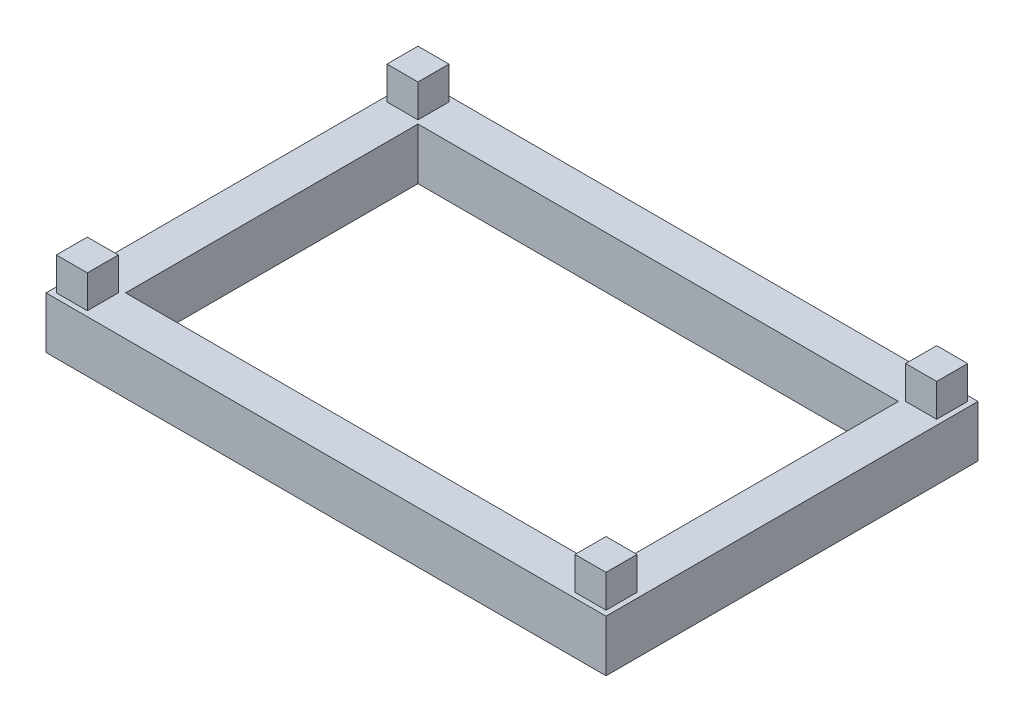
ISO-10303-21;
HEADER;
FILE_DESCRIPTION(('STEP AP214'),'2;1');
FILE_NAME('part.step','',(''),(''),'','','');
FILE_SCHEMA(('AUTOMOTIVE_DESIGN { 1 0 10303 214 1 1 1 1 }'));
ENDSEC;
DATA;
#1=APPLICATION_CONTEXT('core data for automotive mechanical design processes');
#2=APPLICATION_PROTOCOL_DEFINITION('international standard','automotive_design',2000,#1);
#3=PRODUCT_CONTEXT('',#1,'mechanical');
#4=PRODUCT('Part','Part','',(#3));
#5=PRODUCT_RELATED_PRODUCT_CATEGORY('part','',(#4));
#6=PRODUCT_DEFINITION_FORMATION('','',#4);
#7=PRODUCT_DEFINITION_CONTEXT('part definition',#1,'design');
#8=PRODUCT_DEFINITION('design','',#6,#7);
#9=PRODUCT_DEFINITION_SHAPE('','',#8);
#10=(LENGTH_UNIT() NAMED_UNIT(*) SI_UNIT(.MILLI.,.METRE.));
#11=(NAMED_UNIT(*) PLANE_ANGLE_UNIT() SI_UNIT($,.RADIAN.));
#12=(NAMED_UNIT(*) SI_UNIT($,.STERADIAN.) SOLID_ANGLE_UNIT());
#13=UNCERTAINTY_MEASURE_WITH_UNIT(LENGTH_MEASURE(1.E-05),#10,'distance_accuracy_value','');
#14=(GEOMETRIC_REPRESENTATION_CONTEXT(3) GLOBAL_UNCERTAINTY_ASSIGNED_CONTEXT((#13)) GLOBAL_UNIT_ASSIGNED_CONTEXT((#10,
#11,#12)) REPRESENTATION_CONTEXT('',''));
#15=CARTESIAN_POINT('',(0.,0.,0.));
#16=DIRECTION('',(0.,0.,1.));
#17=DIRECTION('',(1.,0.,0.));
#18=AXIS2_PLACEMENT_3D('',#15,#16,#17);
#19=CARTESIAN_POINT('',(0.,10.,0.));
#20=DIRECTION('',(0.,-1.,0.));
#21=DIRECTION('',(0.,0.,-1.));
#22=AXIS2_PLACEMENT_3D('',#19,#20,#21);
#23=PLANE('',#22);
#24=DIRECTION('',(0.,0.,1.));
#25=VECTOR('',#24,1.);
#26=CARTESIAN_POINT('',(1.,10.,-71.));
#27=LINE('',#26,#25);
#28=CARTESIAN_POINT('',(1.,10.,-71.));
#29=VERTEX_POINT('',#28);
#30=CARTESIAN_POINT('',(1.,10.,-65.));
#31=VERTEX_POINT('',#30);
#32=EDGE_CURVE('E218',#29,#31,#27,.T.);
#33=ORIENTED_EDGE('',*,*,#32,.F.);
#34=DIRECTION('',(-1.,0.,0.));
#35=VECTOR('',#34,1.);
#36=CARTESIAN_POINT('',(1.,10.,-71.));
#37=LINE('',#36,#35);
#38=CARTESIAN_POINT('',(7.,10.,-71.));
#39=VERTEX_POINT('',#38);
#40=EDGE_CURVE('E231',#39,#29,#37,.T.);
#41=ORIENTED_EDGE('',*,*,#40,.F.);
#42=DIRECTION('',(0.,0.,-1.));
#43=VECTOR('',#42,1.);
#44=CARTESIAN_POINT('',(7.,10.,-71.));
#45=LINE('',#44,#43);
#46=CARTESIAN_POINT('',(7.,10.,-65.));
#47=VERTEX_POINT('',#46);
#48=EDGE_CURVE('E240',#47,#39,#45,.T.);
#49=ORIENTED_EDGE('',*,*,#48,.F.);
#50=DIRECTION('',(1.,0.,0.));
#51=VECTOR('',#50,1.);
#52=CARTESIAN_POINT('',(1.,10.,-65.));
#53=LINE('',#52,#51);
#54=EDGE_CURVE('E221',#31,#47,#53,.T.);
#55=ORIENTED_EDGE('',*,*,#54,.F.);
#56=EDGE_LOOP('',(#33,#41,#49,#55));
#57=FACE_BOUND('',#56,.T.);
#58=DIRECTION('',(0.,0.,1.));
#59=VECTOR('',#58,1.);
#60=CARTESIAN_POINT('',(1.00000000000002,10.,-7.));
#61=LINE('',#60,#59);
#62=CARTESIAN_POINT('',(1.00000000000002,10.,-7.));
#63=VERTEX_POINT('',#62);
#64=CARTESIAN_POINT('',(1.00000000000002,10.,-1.));
#65=VERTEX_POINT('',#64);
#66=EDGE_CURVE('E289',#63,#65,#61,.T.);
#67=ORIENTED_EDGE('',*,*,#66,.F.);
#68=DIRECTION('',(-1.,0.,0.));
#69=VECTOR('',#68,1.);
#70=CARTESIAN_POINT('',(1.00000000000002,10.,-7.));
#71=LINE('',#70,#69);
#72=CARTESIAN_POINT('',(7.00000000000002,10.,-7.));
#73=VERTEX_POINT('',#72);
#74=EDGE_CURVE('E294',#73,#63,#71,.T.);
#75=ORIENTED_EDGE('',*,*,#74,.F.);
#76=DIRECTION('',(0.,0.,-1.));
#77=VECTOR('',#76,1.);
#78=CARTESIAN_POINT('',(7.00000000000002,10.,-7.));
#79=LINE('',#78,#77);
#80=CARTESIAN_POINT('',(7.00000000000002,10.,-1.));
#81=VERTEX_POINT('',#80);
#82=EDGE_CURVE('E306',#81,#73,#79,.T.);
#83=ORIENTED_EDGE('',*,*,#82,.F.);
#84=DIRECTION('',(1.,0.,0.));
#85=VECTOR('',#84,1.);
#86=CARTESIAN_POINT('',(1.00000000000002,10.,-1.));
#87=LINE('',#86,#85);
#88=EDGE_CURVE('E303',#65,#81,#87,.T.);
#89=ORIENTED_EDGE('',*,*,#88,.F.);
#90=EDGE_LOOP('',(#67,#75,#83,#89));
#91=FACE_BOUND('',#90,.T.);
#92=DIRECTION('',(1.,0.,0.));
#93=VECTOR('',#92,1.);
#94=CARTESIAN_POINT('',(7.7,10.,-7.7));
#95=LINE('',#94,#93);
#96=CARTESIAN_POINT('',(7.7,10.,-7.7));
#97=VERTEX_POINT('',#96);
#98=CARTESIAN_POINT('',(100.7,10.,-7.7));
#99=VERTEX_POINT('',#98);
#100=EDGE_CURVE('E338',#97,#99,#95,.T.);
#101=ORIENTED_EDGE('',*,*,#100,.F.);
#102=DIRECTION('',(0.,0.,1.));
#103=VECTOR('',#102,1.);
#104=CARTESIAN_POINT('',(7.7,10.,-64.3));
#105=LINE('',#104,#103);
#106=CARTESIAN_POINT('',(7.7,10.,-64.3));
#107=VERTEX_POINT('',#106);
#108=EDGE_CURVE('E322',#107,#97,#105,.T.);
#109=ORIENTED_EDGE('',*,*,#108,.F.);
#110=DIRECTION('',(-1.,0.,0.));
#111=VECTOR('',#110,1.);
#112=CARTESIAN_POINT('',(100.7,10.,-64.3));
#113=LINE('',#112,#111);
#114=CARTESIAN_POINT('',(100.7,10.,-64.3));
#115=VERTEX_POINT('',#114);
#116=EDGE_CURVE('E327',#115,#107,#113,.T.);
#117=ORIENTED_EDGE('',*,*,#116,.F.);
#118=DIRECTION('',(0.,0.,-1.));
#119=VECTOR('',#118,1.);
#120=CARTESIAN_POINT('',(100.7,10.,-7.7));
#121=LINE('',#120,#119);
#122=EDGE_CURVE('E341',#99,#115,#121,.T.);
#123=ORIENTED_EDGE('',*,*,#122,.F.);
#124=EDGE_LOOP('',(#101,#109,#117,#123));
#125=FACE_BOUND('',#124,.T.);
#126=DIRECTION('',(0.,0.,1.));
#127=VECTOR('',#126,1.);
#128=CARTESIAN_POINT('',(0.,10.,0.));
#129=LINE('',#128,#127);
#130=CARTESIAN_POINT('',(0.,10.,-72.));
#131=VERTEX_POINT('',#130);
#132=CARTESIAN_POINT('',(0.,10.,0.));
#133=VERTEX_POINT('',#132);
#134=EDGE_CURVE('E355',#131,#133,#129,.T.);
#135=ORIENTED_EDGE('',*,*,#134,.T.);
#136=DIRECTION('',(1.,0.,0.));
#137=VECTOR('',#136,1.);
#138=CARTESIAN_POINT('',(0.,10.,0.));
#139=LINE('',#138,#137);
#140=CARTESIAN_POINT('',(108.4,10.,0.));
#141=VERTEX_POINT('',#140);
#142=EDGE_CURVE('E358',#133,#141,#139,.T.);
#143=ORIENTED_EDGE('',*,*,#142,.T.);
#144=DIRECTION('',(0.,0.,-1.));
#145=VECTOR('',#144,1.);
#146=CARTESIAN_POINT('',(108.4,10.,0.));
#147=LINE('',#146,#145);
#148=CARTESIAN_POINT('',(108.4,10.,-72.));
#149=VERTEX_POINT('',#148);
#150=EDGE_CURVE('E361',#141,#149,#147,.T.);
#151=ORIENTED_EDGE('',*,*,#150,.T.);
#152=DIRECTION('',(-1.,0.,0.));
#153=VECTOR('',#152,1.);
#154=CARTESIAN_POINT('',(0.,10.,-72.));
#155=LINE('',#154,#153);
#156=EDGE_CURVE('E363',#149,#131,#155,.T.);
#157=ORIENTED_EDGE('',*,*,#156,.T.);
#158=EDGE_LOOP('',(#135,#143,#151,#157));
#159=FACE_BOUND('',#158,.T.);
#160=DIRECTION('',(0.,0.,1.));
#161=VECTOR('',#160,1.);
#162=CARTESIAN_POINT('',(101.4,10.,-7.));
#163=LINE('',#162,#161);
#164=CARTESIAN_POINT('',(101.4,10.,-7.));
#165=VERTEX_POINT('',#164);
#166=CARTESIAN_POINT('',(101.4,10.,-1.));
#167=VERTEX_POINT('',#166);
#168=EDGE_CURVE('E256',#165,#167,#163,.T.);
#169=ORIENTED_EDGE('',*,*,#168,.F.);
#170=DIRECTION('',(-1.,0.,0.));
#171=VECTOR('',#170,1.);
#172=CARTESIAN_POINT('',(101.4,10.,-7.));
#173=LINE('',#172,#171);
#174=CARTESIAN_POINT('',(107.4,10.,-7.));
#175=VERTEX_POINT('',#174);
#176=EDGE_CURVE('E261',#175,#165,#173,.T.);
#177=ORIENTED_EDGE('',*,*,#176,.F.);
#178=DIRECTION('',(0.,0.,-1.));
#179=VECTOR('',#178,1.);
#180=CARTESIAN_POINT('',(107.4,10.,-7.));
#181=LINE('',#180,#179);
#182=CARTESIAN_POINT('',(107.4,10.,-1.));
#183=VERTEX_POINT('',#182);
#184=EDGE_CURVE('E273',#183,#175,#181,.T.);
#185=ORIENTED_EDGE('',*,*,#184,.F.);
#186=DIRECTION('',(1.,0.,0.));
#187=VECTOR('',#186,1.);
#188=CARTESIAN_POINT('',(101.4,10.,-1.));
#189=LINE('',#188,#187);
#190=EDGE_CURVE('E270',#167,#183,#189,.T.);
#191=ORIENTED_EDGE('',*,*,#190,.F.);
#192=EDGE_LOOP('',(#169,#177,#185,#191));
#193=FACE_BOUND('',#192,.T.);
#194=DIRECTION('',(0.,0.,1.));
#195=VECTOR('',#194,1.);
#196=CARTESIAN_POINT('',(101.4,10.,-71.));
#197=LINE('',#196,#195);
#198=CARTESIAN_POINT('',(101.4,10.,-71.));
#199=VERTEX_POINT('',#198);
#200=CARTESIAN_POINT('',(101.4,10.,-65.));
#201=VERTEX_POINT('',#200);
#202=EDGE_CURVE('E217',#199,#201,#197,.T.);
#203=ORIENTED_EDGE('',*,*,#202,.F.);
#204=DIRECTION('',(-1.,0.,0.));
#205=VECTOR('',#204,1.);
#206=CARTESIAN_POINT('',(101.4,10.,-71.));
#207=LINE('',#206,#205);
#208=CARTESIAN_POINT('',(107.4,10.,-71.));
#209=VERTEX_POINT('',#208);
#210=EDGE_CURVE('E214',#209,#199,#207,.T.);
#211=ORIENTED_EDGE('',*,*,#210,.F.);
#212=DIRECTION('',(0.,0.,-1.));
#213=VECTOR('',#212,1.);
#214=CARTESIAN_POINT('',(107.4,10.,-71.));
#215=LINE('',#214,#213);
#216=CARTESIAN_POINT('',(107.4,10.,-65.));
#217=VERTEX_POINT('',#216);
#218=EDGE_CURVE('E56',#217,#209,#215,.T.);
#219=ORIENTED_EDGE('',*,*,#218,.F.);
#220=DIRECTION('',(1.,0.,0.));
#221=VECTOR('',#220,1.);
#222=CARTESIAN_POINT('',(101.4,10.,-65.));
#223=LINE('',#222,#221);
#224=EDGE_CURVE('E51',#201,#217,#223,.T.);
#225=ORIENTED_EDGE('',*,*,#224,.F.);
#226=EDGE_LOOP('',(#203,#211,#219,#225));
#227=FACE_BOUND('',#226,.T.);
#228=ADVANCED_FACE('F36',(#57,#91,#125,#159,#193,#227),#23,.F.);
#229=CARTESIAN_POINT('',(0.,10.,0.));
#230=DIRECTION('',(1.,0.,0.));
#231=DIRECTION('',(0.,0.,-1.));
#232=AXIS2_PLACEMENT_3D('',#229,#230,#231);
#233=PLANE('',#232);
#234=DIRECTION('',(0.,0.,1.));
#235=VECTOR('',#234,1.);
#236=CARTESIAN_POINT('',(0.,0.,0.));
#237=LINE('',#236,#235);
#238=CARTESIAN_POINT('',(0.,0.,-72.));
#239=VERTEX_POINT('',#238);
#240=CARTESIAN_POINT('',(0.,0.,0.));
#241=VERTEX_POINT('',#240);
#242=EDGE_CURVE('E348',#239,#241,#237,.T.);
#243=ORIENTED_EDGE('',*,*,#242,.T.);
#244=DIRECTION('',(0.,-1.,0.));
#245=VECTOR('',#244,1.);
#246=CARTESIAN_POINT('',(0.,10.,0.));
#247=LINE('',#246,#245);
#248=EDGE_CURVE('E11',#133,#241,#247,.T.);
#249=ORIENTED_EDGE('',*,*,#248,.F.);
#250=ORIENTED_EDGE('',*,*,#134,.F.);
#251=DIRECTION('',(0.,-1.,0.));
#252=VECTOR('',#251,1.);
#253=CARTESIAN_POINT('',(0.,10.,-72.));
#254=LINE('',#253,#252);
#255=EDGE_CURVE('E365',#131,#239,#254,.T.);
#256=ORIENTED_EDGE('',*,*,#255,.T.);
#257=EDGE_LOOP('',(#243,#249,#250,#256));
#258=FACE_BOUND('',#257,.T.);
#259=ADVANCED_FACE('F38',(#258),#233,.F.);
#260=CARTESIAN_POINT('',(0.,10.,0.));
#261=DIRECTION('',(0.,0.,-1.));
#262=DIRECTION('',(-1.,0.,0.));
#263=AXIS2_PLACEMENT_3D('',#260,#261,#262);
#264=PLANE('',#263);
#265=DIRECTION('',(1.,0.,0.));
#266=VECTOR('',#265,1.);
#267=CARTESIAN_POINT('',(0.,0.,0.));
#268=LINE('',#267,#266);
#269=CARTESIAN_POINT('',(108.4,0.,0.));
#270=VERTEX_POINT('',#269);
#271=EDGE_CURVE('E368',#241,#270,#268,.T.);
#272=ORIENTED_EDGE('',*,*,#271,.T.);
#273=DIRECTION('',(0.,-1.,0.));
#274=VECTOR('',#273,1.);
#275=CARTESIAN_POINT('',(108.4,10.,0.));
#276=LINE('',#275,#274);
#277=EDGE_CURVE('E44',#141,#270,#276,.T.);
#278=ORIENTED_EDGE('',*,*,#277,.F.);
#279=ORIENTED_EDGE('',*,*,#142,.F.);
#280=ORIENTED_EDGE('',*,*,#248,.T.);
#281=EDGE_LOOP('',(#272,#278,#279,#280));
#282=FACE_BOUND('',#281,.T.);
#283=ADVANCED_FACE('F398',(#282),#264,.F.);
#284=CARTESIAN_POINT('',(108.4,10.,0.));
#285=DIRECTION('',(-1.,0.,0.));
#286=DIRECTION('',(0.,0.,1.));
#287=AXIS2_PLACEMENT_3D('',#284,#285,#286);
#288=PLANE('',#287);
#289=DIRECTION('',(0.,0.,-1.));
#290=VECTOR('',#289,1.);
#291=CARTESIAN_POINT('',(108.4,0.,0.));
#292=LINE('',#291,#290);
#293=CARTESIAN_POINT('',(108.4,0.,-72.));
#294=VERTEX_POINT('',#293);
#295=EDGE_CURVE('E370',#270,#294,#292,.T.);
#296=ORIENTED_EDGE('',*,*,#295,.T.);
#297=DIRECTION('',(0.,-1.,0.));
#298=VECTOR('',#297,1.);
#299=CARTESIAN_POINT('',(108.4,10.,-72.));
#300=LINE('',#299,#298);
#301=EDGE_CURVE('E375',#149,#294,#300,.T.);
#302=ORIENTED_EDGE('',*,*,#301,.F.);
#303=ORIENTED_EDGE('',*,*,#150,.F.);
#304=ORIENTED_EDGE('',*,*,#277,.T.);
#305=EDGE_LOOP('',(#296,#302,#303,#304));
#306=FACE_BOUND('',#305,.T.);
#307=ADVANCED_FACE('F382',(#306),#288,.F.);
#308=CARTESIAN_POINT('',(0.,10.,-72.));
#309=DIRECTION('',(0.,0.,1.));
#310=DIRECTION('',(1.,0.,0.));
#311=AXIS2_PLACEMENT_3D('',#308,#309,#310);
#312=PLANE('',#311);
#313=DIRECTION('',(-1.,0.,0.));
#314=VECTOR('',#313,1.);
#315=CARTESIAN_POINT('',(0.,0.,-72.));
#316=LINE('',#315,#314);
#317=EDGE_CURVE('E359',#294,#239,#316,.T.);
#318=ORIENTED_EDGE('',*,*,#317,.T.);
#319=ORIENTED_EDGE('',*,*,#255,.F.);
#320=ORIENTED_EDGE('',*,*,#156,.F.);
#321=ORIENTED_EDGE('',*,*,#301,.T.);
#322=EDGE_LOOP('',(#318,#319,#320,#321));
#323=FACE_BOUND('',#322,.T.);
#324=ADVANCED_FACE('F391',(#323),#312,.F.);
#325=CARTESIAN_POINT('',(0.,0.,0.));
#326=DIRECTION('',(0.,-1.,0.));
#327=DIRECTION('',(0.,0.,-1.));
#328=AXIS2_PLACEMENT_3D('',#325,#326,#327);
#329=PLANE('',#328);
#330=DIRECTION('',(0.,0.,1.));
#331=VECTOR('',#330,1.);
#332=CARTESIAN_POINT('',(7.7,0.,-64.3));
#333=LINE('',#332,#331);
#334=CARTESIAN_POINT('',(7.7,0.,-64.3));
#335=VERTEX_POINT('',#334);
#336=CARTESIAN_POINT('',(7.7,0.,-7.7));
#337=VERTEX_POINT('',#336);
#338=EDGE_CURVE('E323',#335,#337,#333,.T.);
#339=ORIENTED_EDGE('',*,*,#338,.T.);
#340=DIRECTION('',(1.,0.,0.));
#341=VECTOR('',#340,1.);
#342=CARTESIAN_POINT('',(7.7,0.,-7.7));
#343=LINE('',#342,#341);
#344=CARTESIAN_POINT('',(100.7,0.,-7.7));
#345=VERTEX_POINT('',#344);
#346=EDGE_CURVE('E326',#337,#345,#343,.T.);
#347=ORIENTED_EDGE('',*,*,#346,.T.);
#348=DIRECTION('',(0.,0.,-1.));
#349=VECTOR('',#348,1.);
#350=CARTESIAN_POINT('',(100.7,0.,-7.7));
#351=LINE('',#350,#349);
#352=CARTESIAN_POINT('',(100.7,0.,-64.3));
#353=VERTEX_POINT('',#352);
#354=EDGE_CURVE('E330',#345,#353,#351,.T.);
#355=ORIENTED_EDGE('',*,*,#354,.T.);
#356=DIRECTION('',(-1.,0.,0.));
#357=VECTOR('',#356,1.);
#358=CARTESIAN_POINT('',(100.7,0.,-64.3));
#359=LINE('',#358,#357);
#360=EDGE_CURVE('E333',#353,#335,#359,.T.);
#361=ORIENTED_EDGE('',*,*,#360,.T.);
#362=EDGE_LOOP('',(#339,#347,#355,#361));
#363=FACE_BOUND('',#362,.T.);
#364=ORIENTED_EDGE('',*,*,#242,.F.);
#365=ORIENTED_EDGE('',*,*,#317,.F.);
#366=ORIENTED_EDGE('',*,*,#295,.F.);
#367=ORIENTED_EDGE('',*,*,#271,.F.);
#368=EDGE_LOOP('',(#364,#365,#366,#367));
#369=FACE_BOUND('',#368,.T.);
#370=ADVANCED_FACE('F388',(#363,#369),#329,.T.);
#371=CARTESIAN_POINT('',(7.7,0.,-64.3));
#372=DIRECTION('',(-1.,0.,0.));
#373=DIRECTION('',(0.,0.,1.));
#374=AXIS2_PLACEMENT_3D('',#371,#372,#373);
#375=PLANE('',#374);
#376=ORIENTED_EDGE('',*,*,#108,.T.);
#377=DIRECTION('',(0.,1.,0.));
#378=VECTOR('',#377,1.);
#379=CARTESIAN_POINT('',(7.7,0.,-7.7));
#380=LINE('',#379,#378);
#381=EDGE_CURVE('E336',#337,#97,#380,.T.);
#382=ORIENTED_EDGE('',*,*,#381,.F.);
#383=ORIENTED_EDGE('',*,*,#338,.F.);
#384=DIRECTION('',(0.,1.,0.));
#385=VECTOR('',#384,1.);
#386=CARTESIAN_POINT('',(7.7,0.,-64.3));
#387=LINE('',#386,#385);
#388=EDGE_CURVE('E346',#335,#107,#387,.T.);
#389=ORIENTED_EDGE('',*,*,#388,.T.);
#390=EDGE_LOOP('',(#376,#382,#383,#389));
#391=FACE_BOUND('',#390,.T.);
#392=ADVANCED_FACE('F413',(#391),#375,.F.);
#393=CARTESIAN_POINT('',(100.7,0.,-64.3));
#394=DIRECTION('',(0.,0.,-1.));
#395=DIRECTION('',(-1.,0.,0.));
#396=AXIS2_PLACEMENT_3D('',#393,#394,#395);
#397=PLANE('',#396);
#398=ORIENTED_EDGE('',*,*,#116,.T.);
#399=ORIENTED_EDGE('',*,*,#388,.F.);
#400=ORIENTED_EDGE('',*,*,#360,.F.);
#401=DIRECTION('',(0.,1.,0.));
#402=VECTOR('',#401,1.);
#403=CARTESIAN_POINT('',(100.7,0.,-64.3));
#404=LINE('',#403,#402);
#405=EDGE_CURVE('E349',#353,#115,#404,.T.);
#406=ORIENTED_EDGE('',*,*,#405,.T.);
#407=EDGE_LOOP('',(#398,#399,#400,#406));
#408=FACE_BOUND('',#407,.T.);
#409=ADVANCED_FACE('F433',(#408),#397,.F.);
#410=CARTESIAN_POINT('',(100.7,0.,-7.7));
#411=DIRECTION('',(1.,0.,0.));
#412=DIRECTION('',(0.,0.,-1.));
#413=AXIS2_PLACEMENT_3D('',#410,#411,#412);
#414=PLANE('',#413);
#415=ORIENTED_EDGE('',*,*,#122,.T.);
#416=ORIENTED_EDGE('',*,*,#405,.F.);
#417=ORIENTED_EDGE('',*,*,#354,.F.);
#418=DIRECTION('',(0.,1.,0.));
#419=VECTOR('',#418,1.);
#420=CARTESIAN_POINT('',(100.7,0.,-7.7));
#421=LINE('',#420,#419);
#422=EDGE_CURVE('E351',#345,#99,#421,.T.);
#423=ORIENTED_EDGE('',*,*,#422,.T.);
#424=EDGE_LOOP('',(#415,#416,#417,#423));
#425=FACE_BOUND('',#424,.T.);
#426=ADVANCED_FACE('F440',(#425),#414,.F.);
#427=CARTESIAN_POINT('',(7.7,0.,-7.7));
#428=DIRECTION('',(0.,0.,1.));
#429=DIRECTION('',(1.,0.,0.));
#430=AXIS2_PLACEMENT_3D('',#427,#428,#429);
#431=PLANE('',#430);
#432=ORIENTED_EDGE('',*,*,#100,.T.);
#433=ORIENTED_EDGE('',*,*,#422,.F.);
#434=ORIENTED_EDGE('',*,*,#346,.F.);
#435=ORIENTED_EDGE('',*,*,#381,.T.);
#436=EDGE_LOOP('',(#432,#433,#434,#435));
#437=FACE_BOUND('',#436,.T.);
#438=ADVANCED_FACE('F448',(#437),#431,.F.);
#439=CARTESIAN_POINT('',(1.00000000000002,16.35,-7.));
#440=DIRECTION('',(1.,0.,0.));
#441=DIRECTION('',(0.,0.,-1.));
#442=AXIS2_PLACEMENT_3D('',#439,#440,#441);
#443=PLANE('',#442);
#444=ORIENTED_EDGE('',*,*,#66,.T.);
#445=DIRECTION('',(0.,-1.,0.));
#446=VECTOR('',#445,1.);
#447=CARTESIAN_POINT('',(1.00000000000002,16.35,-1.));
#448=LINE('',#447,#446);
#449=CARTESIAN_POINT('',(1.00000000000002,16.35,-1.));
#450=VERTEX_POINT('',#449);
#451=EDGE_CURVE('E319',#450,#65,#448,.T.);
#452=ORIENTED_EDGE('',*,*,#451,.F.);
#453=DIRECTION('',(0.,0.,1.));
#454=VECTOR('',#453,1.);
#455=CARTESIAN_POINT('',(1.00000000000002,16.35,-7.));
#456=LINE('',#455,#454);
#457=CARTESIAN_POINT('',(1.00000000000002,16.35,-7.));
#458=VERTEX_POINT('',#457);
#459=EDGE_CURVE('E290',#458,#450,#456,.T.);
#460=ORIENTED_EDGE('',*,*,#459,.F.);
#461=DIRECTION('',(0.,-1.,0.));
#462=VECTOR('',#461,1.);
#463=CARTESIAN_POINT('',(1.00000000000002,16.35,-7.));
#464=LINE('',#463,#462);
#465=EDGE_CURVE('E300',#458,#63,#464,.T.);
#466=ORIENTED_EDGE('',*,*,#465,.T.);
#467=EDGE_LOOP('',(#444,#452,#460,#466));
#468=FACE_BOUND('',#467,.T.);
#469=ADVANCED_FACE('F456',(#468),#443,.F.);
#470=CARTESIAN_POINT('',(1.00000000000002,16.35,-1.));
#471=DIRECTION('',(0.,0.,-1.));
#472=DIRECTION('',(-1.,0.,0.));
#473=AXIS2_PLACEMENT_3D('',#470,#471,#472);
#474=PLANE('',#473);
#475=ORIENTED_EDGE('',*,*,#88,.T.);
#476=DIRECTION('',(0.,-1.,0.));
#477=VECTOR('',#476,1.);
#478=CARTESIAN_POINT('',(7.00000000000002,16.35,-1.));
#479=LINE('',#478,#477);
#480=CARTESIAN_POINT('',(7.00000000000002,16.35,-1.));
#481=VERTEX_POINT('',#480);
#482=EDGE_CURVE('E316',#481,#81,#479,.T.);
#483=ORIENTED_EDGE('',*,*,#482,.F.);
#484=DIRECTION('',(1.,0.,0.));
#485=VECTOR('',#484,1.);
#486=CARTESIAN_POINT('',(1.00000000000002,16.35,-1.));
#487=LINE('',#486,#485);
#488=EDGE_CURVE('E293',#450,#481,#487,.T.);
#489=ORIENTED_EDGE('',*,*,#488,.F.);
#490=ORIENTED_EDGE('',*,*,#451,.T.);
#491=EDGE_LOOP('',(#475,#483,#489,#490));
#492=FACE_BOUND('',#491,.T.);
#493=ADVANCED_FACE('F463',(#492),#474,.F.);
#494=CARTESIAN_POINT('',(7.00000000000002,16.35,-7.));
#495=DIRECTION('',(-1.,0.,0.));
#496=DIRECTION('',(0.,0.,1.));
#497=AXIS2_PLACEMENT_3D('',#494,#495,#496);
#498=PLANE('',#497);
#499=ORIENTED_EDGE('',*,*,#82,.T.);
#500=DIRECTION('',(0.,-1.,0.));
#501=VECTOR('',#500,1.);
#502=CARTESIAN_POINT('',(7.00000000000002,16.35,-7.));
#503=LINE('',#502,#501);
#504=CARTESIAN_POINT('',(7.00000000000002,16.35,-7.));
#505=VERTEX_POINT('',#504);
#506=EDGE_CURVE('E313',#505,#73,#503,.T.);
#507=ORIENTED_EDGE('',*,*,#506,.F.);
#508=DIRECTION('',(0.,0.,-1.));
#509=VECTOR('',#508,1.);
#510=CARTESIAN_POINT('',(7.00000000000002,16.35,-7.));
#511=LINE('',#510,#509);
#512=EDGE_CURVE('E296',#481,#505,#511,.T.);
#513=ORIENTED_EDGE('',*,*,#512,.F.);
#514=ORIENTED_EDGE('',*,*,#482,.T.);
#515=EDGE_LOOP('',(#499,#507,#513,#514));
#516=FACE_BOUND('',#515,.T.);
#517=ADVANCED_FACE('F471',(#516),#498,.F.);
#518=CARTESIAN_POINT('',(1.00000000000002,16.35,-7.));
#519=DIRECTION('',(0.,0.,1.));
#520=DIRECTION('',(1.,0.,0.));
#521=AXIS2_PLACEMENT_3D('',#518,#519,#520);
#522=PLANE('',#521);
#523=ORIENTED_EDGE('',*,*,#74,.T.);
#524=ORIENTED_EDGE('',*,*,#465,.F.);
#525=DIRECTION('',(-1.,0.,0.));
#526=VECTOR('',#525,1.);
#527=CARTESIAN_POINT('',(1.00000000000002,16.35,-7.));
#528=LINE('',#527,#526);
#529=EDGE_CURVE('E298',#505,#458,#528,.T.);
#530=ORIENTED_EDGE('',*,*,#529,.F.);
#531=ORIENTED_EDGE('',*,*,#506,.T.);
#532=EDGE_LOOP('',(#523,#524,#530,#531));
#533=FACE_BOUND('',#532,.T.);
#534=ADVANCED_FACE('F479',(#533),#522,.F.);
#535=CARTESIAN_POINT('',(0.,16.35,0.));
#536=DIRECTION('',(0.,1.,0.));
#537=DIRECTION('',(0.,0.,1.));
#538=AXIS2_PLACEMENT_3D('',#535,#536,#537);
#539=PLANE('',#538);
#540=ORIENTED_EDGE('',*,*,#459,.T.);
#541=ORIENTED_EDGE('',*,*,#488,.T.);
#542=ORIENTED_EDGE('',*,*,#512,.T.);
#543=ORIENTED_EDGE('',*,*,#529,.T.);
#544=EDGE_LOOP('',(#540,#541,#542,#543));
#545=FACE_BOUND('',#544,.T.);
#546=ADVANCED_FACE('F487',(#545),#539,.T.);
#547=CARTESIAN_POINT('',(101.4,16.35,-7.));
#548=DIRECTION('',(1.,0.,0.));
#549=DIRECTION('',(0.,0.,-1.));
#550=AXIS2_PLACEMENT_3D('',#547,#548,#549);
#551=PLANE('',#550);
#552=ORIENTED_EDGE('',*,*,#168,.T.);
#553=DIRECTION('',(0.,-1.,0.));
#554=VECTOR('',#553,1.);
#555=CARTESIAN_POINT('',(101.4,16.35,-1.));
#556=LINE('',#555,#554);
#557=CARTESIAN_POINT('',(101.4,16.35,-1.));
#558=VERTEX_POINT('',#557);
#559=EDGE_CURVE('E286',#558,#167,#556,.T.);
#560=ORIENTED_EDGE('',*,*,#559,.F.);
#561=DIRECTION('',(0.,0.,1.));
#562=VECTOR('',#561,1.);
#563=CARTESIAN_POINT('',(101.4,16.35,-7.));
#564=LINE('',#563,#562);
#565=CARTESIAN_POINT('',(101.4,16.35,-7.));
#566=VERTEX_POINT('',#565);
#567=EDGE_CURVE('E257',#566,#558,#564,.T.);
#568=ORIENTED_EDGE('',*,*,#567,.F.);
#569=DIRECTION('',(0.,-1.,0.));
#570=VECTOR('',#569,1.);
#571=CARTESIAN_POINT('',(101.4,16.35,-7.));
#572=LINE('',#571,#570);
#573=EDGE_CURVE('E267',#566,#165,#572,.T.);
#574=ORIENTED_EDGE('',*,*,#573,.T.);
#575=EDGE_LOOP('',(#552,#560,#568,#574));
#576=FACE_BOUND('',#575,.T.);
#577=ADVANCED_FACE('F495',(#576),#551,.F.);
#578=CARTESIAN_POINT('',(101.4,16.35,-1.));
#579=DIRECTION('',(0.,0.,-1.));
#580=DIRECTION('',(-1.,0.,0.));
#581=AXIS2_PLACEMENT_3D('',#578,#579,#580);
#582=PLANE('',#581);
#583=ORIENTED_EDGE('',*,*,#190,.T.);
#584=DIRECTION('',(0.,-1.,0.));
#585=VECTOR('',#584,1.);
#586=CARTESIAN_POINT('',(107.4,16.35,-1.));
#587=LINE('',#586,#585);
#588=CARTESIAN_POINT('',(107.4,16.35,-1.));
#589=VERTEX_POINT('',#588);
#590=EDGE_CURVE('E283',#589,#183,#587,.T.);
#591=ORIENTED_EDGE('',*,*,#590,.F.);
#592=DIRECTION('',(1.,0.,0.));
#593=VECTOR('',#592,1.);
#594=CARTESIAN_POINT('',(101.4,16.35,-1.));
#595=LINE('',#594,#593);
#596=EDGE_CURVE('E260',#558,#589,#595,.T.);
#597=ORIENTED_EDGE('',*,*,#596,.F.);
#598=ORIENTED_EDGE('',*,*,#559,.T.);
#599=EDGE_LOOP('',(#583,#591,#597,#598));
#600=FACE_BOUND('',#599,.T.);
#601=ADVANCED_FACE('F503',(#600),#582,.F.);
#602=CARTESIAN_POINT('',(107.4,16.35,-7.));
#603=DIRECTION('',(-1.,0.,0.));
#604=DIRECTION('',(0.,0.,1.));
#605=AXIS2_PLACEMENT_3D('',#602,#603,#604);
#606=PLANE('',#605);
#607=ORIENTED_EDGE('',*,*,#184,.T.);
#608=DIRECTION('',(0.,-1.,0.));
#609=VECTOR('',#608,1.);
#610=CARTESIAN_POINT('',(107.4,16.35,-7.));
#611=LINE('',#610,#609);
#612=CARTESIAN_POINT('',(107.4,16.35,-7.));
#613=VERTEX_POINT('',#612);
#614=EDGE_CURVE('E280',#613,#175,#611,.T.);
#615=ORIENTED_EDGE('',*,*,#614,.F.);
#616=DIRECTION('',(0.,0.,-1.));
#617=VECTOR('',#616,1.);
#618=CARTESIAN_POINT('',(107.4,16.35,-7.));
#619=LINE('',#618,#617);
#620=EDGE_CURVE('E263',#589,#613,#619,.T.);
#621=ORIENTED_EDGE('',*,*,#620,.F.);
#622=ORIENTED_EDGE('',*,*,#590,.T.);
#623=EDGE_LOOP('',(#607,#615,#621,#622));
#624=FACE_BOUND('',#623,.T.);
#625=ADVANCED_FACE('F511',(#624),#606,.F.);
#626=CARTESIAN_POINT('',(101.4,16.35,-7.));
#627=DIRECTION('',(0.,0.,1.));
#628=DIRECTION('',(1.,0.,0.));
#629=AXIS2_PLACEMENT_3D('',#626,#627,#628);
#630=PLANE('',#629);
#631=ORIENTED_EDGE('',*,*,#176,.T.);
#632=ORIENTED_EDGE('',*,*,#573,.F.);
#633=DIRECTION('',(-1.,0.,0.));
#634=VECTOR('',#633,1.);
#635=CARTESIAN_POINT('',(101.4,16.35,-7.));
#636=LINE('',#635,#634);
#637=EDGE_CURVE('E265',#613,#566,#636,.T.);
#638=ORIENTED_EDGE('',*,*,#637,.F.);
#639=ORIENTED_EDGE('',*,*,#614,.T.);
#640=EDGE_LOOP('',(#631,#632,#638,#639));
#641=FACE_BOUND('',#640,.T.);
#642=ADVANCED_FACE('F519',(#641),#630,.F.);
#643=CARTESIAN_POINT('',(0.,16.35,0.));
#644=DIRECTION('',(0.,1.,0.));
#645=DIRECTION('',(0.,0.,1.));
#646=AXIS2_PLACEMENT_3D('',#643,#644,#645);
#647=PLANE('',#646);
#648=ORIENTED_EDGE('',*,*,#567,.T.);
#649=ORIENTED_EDGE('',*,*,#596,.T.);
#650=ORIENTED_EDGE('',*,*,#620,.T.);
#651=ORIENTED_EDGE('',*,*,#637,.T.);
#652=EDGE_LOOP('',(#648,#649,#650,#651));
#653=FACE_BOUND('',#652,.T.);
#654=ADVANCED_FACE('F527',(#653),#647,.T.);
#655=CARTESIAN_POINT('',(1.,16.35,-71.));
#656=DIRECTION('',(1.,0.,0.));
#657=DIRECTION('',(0.,0.,-1.));
#658=AXIS2_PLACEMENT_3D('',#655,#656,#657);
#659=PLANE('',#658);
#660=ORIENTED_EDGE('',*,*,#32,.T.);
#661=DIRECTION('',(0.,-1.,0.));
#662=VECTOR('',#661,1.);
#663=CARTESIAN_POINT('',(1.,16.35,-65.));
#664=LINE('',#663,#662);
#665=CARTESIAN_POINT('',(1.,16.35,-65.));
#666=VERTEX_POINT('',#665);
#667=EDGE_CURVE('E253',#666,#31,#664,.T.);
#668=ORIENTED_EDGE('',*,*,#667,.F.);
#669=DIRECTION('',(0.,0.,1.));
#670=VECTOR('',#669,1.);
#671=CARTESIAN_POINT('',(1.,16.35,-71.));
#672=LINE('',#671,#670);
#673=CARTESIAN_POINT('',(1.,16.35,-71.));
#674=VERTEX_POINT('',#673);
#675=EDGE_CURVE('E227',#674,#666,#672,.T.);
#676=ORIENTED_EDGE('',*,*,#675,.F.);
#677=DIRECTION('',(0.,-1.,0.));
#678=VECTOR('',#677,1.);
#679=CARTESIAN_POINT('',(1.,16.35,-71.));
#680=LINE('',#679,#678);
#681=EDGE_CURVE('E236',#674,#29,#680,.T.);
#682=ORIENTED_EDGE('',*,*,#681,.T.);
#683=EDGE_LOOP('',(#660,#668,#676,#682));
#684=FACE_BOUND('',#683,.T.);
#685=ADVANCED_FACE('F535',(#684),#659,.F.);
#686=CARTESIAN_POINT('',(1.,16.35,-65.));
#687=DIRECTION('',(0.,0.,-1.));
#688=DIRECTION('',(-1.,0.,0.));
#689=AXIS2_PLACEMENT_3D('',#686,#687,#688);
#690=PLANE('',#689);
#691=ORIENTED_EDGE('',*,*,#54,.T.);
#692=DIRECTION('',(0.,-1.,0.));
#693=VECTOR('',#692,1.);
#694=CARTESIAN_POINT('',(7.,16.35,-65.));
#695=LINE('',#694,#693);
#696=CARTESIAN_POINT('',(7.,16.35,-65.));
#697=VERTEX_POINT('',#696);
#698=EDGE_CURVE('E250',#697,#47,#695,.T.);
#699=ORIENTED_EDGE('',*,*,#698,.F.);
#700=DIRECTION('',(1.,0.,0.));
#701=VECTOR('',#700,1.);
#702=CARTESIAN_POINT('',(1.,16.35,-65.));
#703=LINE('',#702,#701);
#704=EDGE_CURVE('E230',#666,#697,#703,.T.);
#705=ORIENTED_EDGE('',*,*,#704,.F.);
#706=ORIENTED_EDGE('',*,*,#667,.T.);
#707=EDGE_LOOP('',(#691,#699,#705,#706));
#708=FACE_BOUND('',#707,.T.);
#709=ADVANCED_FACE('F543',(#708),#690,.F.);
#710=CARTESIAN_POINT('',(7.,16.35,-71.));
#711=DIRECTION('',(-1.,0.,0.));
#712=DIRECTION('',(0.,0.,1.));
#713=AXIS2_PLACEMENT_3D('',#710,#711,#712);
#714=PLANE('',#713);
#715=ORIENTED_EDGE('',*,*,#48,.T.);
#716=DIRECTION('',(0.,-1.,0.));
#717=VECTOR('',#716,1.);
#718=CARTESIAN_POINT('',(7.,16.35,-71.));
#719=LINE('',#718,#717);
#720=CARTESIAN_POINT('',(7.,16.35,-71.));
#721=VERTEX_POINT('',#720);
#722=EDGE_CURVE('E247',#721,#39,#719,.T.);
#723=ORIENTED_EDGE('',*,*,#722,.F.);
#724=DIRECTION('',(0.,0.,-1.));
#725=VECTOR('',#724,1.);
#726=CARTESIAN_POINT('',(7.,16.35,-71.));
#727=LINE('',#726,#725);
#728=EDGE_CURVE('E233',#697,#721,#727,.T.);
#729=ORIENTED_EDGE('',*,*,#728,.F.);
#730=ORIENTED_EDGE('',*,*,#698,.T.);
#731=EDGE_LOOP('',(#715,#723,#729,#730));
#732=FACE_BOUND('',#731,.T.);
#733=ADVANCED_FACE('F551',(#732),#714,.F.);
#734=CARTESIAN_POINT('',(1.,16.35,-71.));
#735=DIRECTION('',(0.,0.,1.));
#736=DIRECTION('',(1.,0.,0.));
#737=AXIS2_PLACEMENT_3D('',#734,#735,#736);
#738=PLANE('',#737);
#739=ORIENTED_EDGE('',*,*,#40,.T.);
#740=ORIENTED_EDGE('',*,*,#681,.F.);
#741=DIRECTION('',(-1.,0.,0.));
#742=VECTOR('',#741,1.);
#743=CARTESIAN_POINT('',(1.,16.35,-71.));
#744=LINE('',#743,#742);
#745=EDGE_CURVE('E235',#721,#674,#744,.T.);
#746=ORIENTED_EDGE('',*,*,#745,.F.);
#747=ORIENTED_EDGE('',*,*,#722,.T.);
#748=EDGE_LOOP('',(#739,#740,#746,#747));
#749=FACE_BOUND('',#748,.T.);
#750=ADVANCED_FACE('F559',(#749),#738,.F.);
#751=CARTESIAN_POINT('',(0.,16.35,0.));
#752=DIRECTION('',(0.,1.,0.));
#753=DIRECTION('',(0.,0.,1.));
#754=AXIS2_PLACEMENT_3D('',#751,#752,#753);
#755=PLANE('',#754);
#756=ORIENTED_EDGE('',*,*,#675,.T.);
#757=ORIENTED_EDGE('',*,*,#704,.T.);
#758=ORIENTED_EDGE('',*,*,#728,.T.);
#759=ORIENTED_EDGE('',*,*,#745,.T.);
#760=EDGE_LOOP('',(#756,#757,#758,#759));
#761=FACE_BOUND('',#760,.T.);
#762=ADVANCED_FACE('F567',(#761),#755,.T.);
#763=CARTESIAN_POINT('',(101.4,16.35,-71.));
#764=DIRECTION('',(1.,0.,0.));
#765=DIRECTION('',(0.,0.,-1.));
#766=AXIS2_PLACEMENT_3D('',#763,#764,#765);
#767=PLANE('',#766);
#768=ORIENTED_EDGE('',*,*,#202,.T.);
#769=DIRECTION('',(0.,-1.,0.));
#770=VECTOR('',#769,1.);
#771=CARTESIAN_POINT('',(101.4,16.35,-65.));
#772=LINE('',#771,#770);
#773=CARTESIAN_POINT('',(101.4,16.35,-65.));
#774=VERTEX_POINT('',#773);
#775=EDGE_CURVE('E198',#774,#201,#772,.T.);
#776=ORIENTED_EDGE('',*,*,#775,.F.);
#777=DIRECTION('',(0.,0.,1.));
#778=VECTOR('',#777,1.);
#779=CARTESIAN_POINT('',(101.4,16.35,-71.));
#780=LINE('',#779,#778);
#781=CARTESIAN_POINT('',(101.4,16.35,-71.));
#782=VERTEX_POINT('',#781);
#783=EDGE_CURVE('E205',#782,#774,#780,.T.);
#784=ORIENTED_EDGE('',*,*,#783,.F.);
#785=DIRECTION('',(0.,-1.,0.));
#786=VECTOR('',#785,1.);
#787=CARTESIAN_POINT('',(101.4,16.35,-71.));
#788=LINE('',#787,#786);
#789=EDGE_CURVE('E684',#782,#199,#788,.T.);
#790=ORIENTED_EDGE('',*,*,#789,.T.);
#791=EDGE_LOOP('',(#768,#776,#784,#790));
#792=FACE_BOUND('',#791,.T.);
#793=ADVANCED_FACE('F216',(#792),#767,.F.);
#794=CARTESIAN_POINT('',(101.4,16.35,-65.));
#795=DIRECTION('',(0.,0.,-1.));
#796=DIRECTION('',(-1.,0.,0.));
#797=AXIS2_PLACEMENT_3D('',#794,#795,#796);
#798=PLANE('',#797);
#799=ORIENTED_EDGE('',*,*,#224,.T.);
#800=DIRECTION('',(0.,-1.,0.));
#801=VECTOR('',#800,1.);
#802=CARTESIAN_POINT('',(107.4,16.35,-65.));
#803=LINE('',#802,#801);
#804=CARTESIAN_POINT('',(107.4,16.35,-65.));
#805=VERTEX_POINT('',#804);
#806=EDGE_CURVE('E201',#805,#217,#803,.T.);
#807=ORIENTED_EDGE('',*,*,#806,.F.);
#808=DIRECTION('',(1.,0.,0.));
#809=VECTOR('',#808,1.);
#810=CARTESIAN_POINT('',(101.4,16.35,-65.));
#811=LINE('',#810,#809);
#812=EDGE_CURVE('E194',#774,#805,#811,.T.);
#813=ORIENTED_EDGE('',*,*,#812,.F.);
#814=ORIENTED_EDGE('',*,*,#775,.T.);
#815=EDGE_LOOP('',(#799,#807,#813,#814));
#816=FACE_BOUND('',#815,.T.);
#817=ADVANCED_FACE('F196',(#816),#798,.F.);
#818=CARTESIAN_POINT('',(107.4,16.35,-71.));
#819=DIRECTION('',(-1.,0.,0.));
#820=DIRECTION('',(0.,0.,1.));
#821=AXIS2_PLACEMENT_3D('',#818,#819,#820);
#822=PLANE('',#821);
#823=ORIENTED_EDGE('',*,*,#218,.T.);
#824=DIRECTION('',(0.,-1.,0.));
#825=VECTOR('',#824,1.);
#826=CARTESIAN_POINT('',(107.4,16.35,-71.));
#827=LINE('',#826,#825);
#828=CARTESIAN_POINT('',(107.4,16.35,-71.));
#829=VERTEX_POINT('',#828);
#830=EDGE_CURVE('E223',#829,#209,#827,.T.);
#831=ORIENTED_EDGE('',*,*,#830,.F.);
#832=DIRECTION('',(0.,0.,-1.));
#833=VECTOR('',#832,1.);
#834=CARTESIAN_POINT('',(107.4,16.35,-71.));
#835=LINE('',#834,#833);
#836=EDGE_CURVE('E204',#805,#829,#835,.T.);
#837=ORIENTED_EDGE('',*,*,#836,.F.);
#838=ORIENTED_EDGE('',*,*,#806,.T.);
#839=EDGE_LOOP('',(#823,#831,#837,#838));
#840=FACE_BOUND('',#839,.T.);
#841=ADVANCED_FACE('F588',(#840),#822,.F.);
#842=CARTESIAN_POINT('',(101.4,16.35,-71.));
#843=DIRECTION('',(0.,0.,1.));
#844=DIRECTION('',(1.,0.,0.));
#845=AXIS2_PLACEMENT_3D('',#842,#843,#844);
#846=PLANE('',#845);
#847=ORIENTED_EDGE('',*,*,#210,.T.);
#848=ORIENTED_EDGE('',*,*,#789,.F.);
#849=DIRECTION('',(-1.,0.,0.));
#850=VECTOR('',#849,1.);
#851=CARTESIAN_POINT('',(101.4,16.35,-71.));
#852=LINE('',#851,#850);
#853=EDGE_CURVE('E210',#829,#782,#852,.T.);
#854=ORIENTED_EDGE('',*,*,#853,.F.);
#855=ORIENTED_EDGE('',*,*,#830,.T.);
#856=EDGE_LOOP('',(#847,#848,#854,#855));
#857=FACE_BOUND('',#856,.T.);
#858=ADVANCED_FACE('F595',(#857),#846,.F.);
#859=CARTESIAN_POINT('',(0.,16.35,0.));
#860=DIRECTION('',(0.,1.,0.));
#861=DIRECTION('',(0.,0.,1.));
#862=AXIS2_PLACEMENT_3D('',#859,#860,#861);
#863=PLANE('',#862);
#864=ORIENTED_EDGE('',*,*,#783,.T.);
#865=ORIENTED_EDGE('',*,*,#812,.T.);
#866=ORIENTED_EDGE('',*,*,#836,.T.);
#867=ORIENTED_EDGE('',*,*,#853,.T.);
#868=EDGE_LOOP('',(#864,#865,#866,#867));
#869=FACE_BOUND('',#868,.T.);
#870=ADVANCED_FACE('F208',(#869),#863,.T.);
#871=CLOSED_SHELL('',(#228,#259,#283,#307,#324,#370,#392,#409,#426,#438,#469,#493,#517,#534,
#546,#577,#601,#625,#642,#654,#685,#709,#733,#750,#762,#793,#817,#841,#858,#870));
#872=MANIFOLD_SOLID_BREP('B2',#871);
#873=ADVANCED_BREP_SHAPE_REPRESENTATION('',(#18,#872),#14);
#874=SHAPE_DEFINITION_REPRESENTATION(#9,#873);
ENDSEC;
END-ISO-10303-21;
